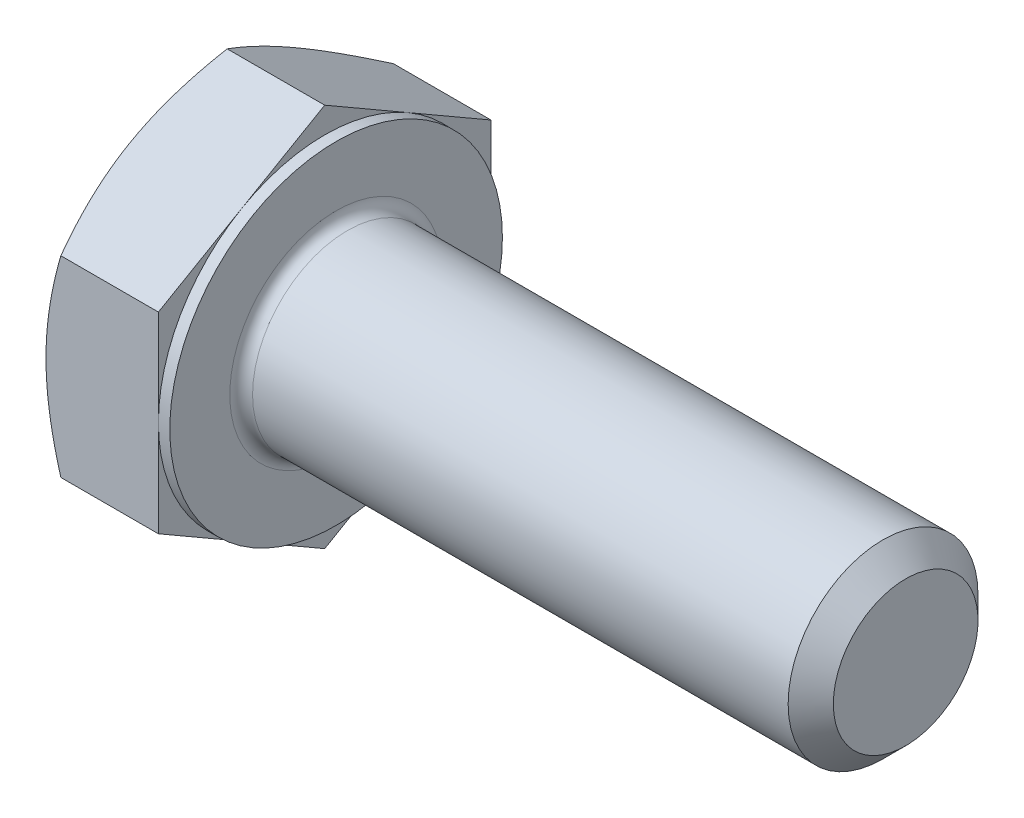
ISO-10303-21;
HEADER;
FILE_DESCRIPTION(('STEP AP214'),'2;1');
FILE_NAME('part.step','',(''),(''),'','','');
FILE_SCHEMA(('AUTOMOTIVE_DESIGN { 1 0 10303 214 1 1 1 1 }'));
ENDSEC;
DATA;
#1=APPLICATION_CONTEXT('core data for automotive mechanical design processes');
#2=APPLICATION_PROTOCOL_DEFINITION('international standard','automotive_design',2000,#1);
#3=PRODUCT_CONTEXT('',#1,'mechanical');
#4=PRODUCT('Part','Part','',(#3));
#5=PRODUCT_RELATED_PRODUCT_CATEGORY('part','',(#4));
#6=PRODUCT_DEFINITION_FORMATION('','',#4);
#7=PRODUCT_DEFINITION_CONTEXT('part definition',#1,'design');
#8=PRODUCT_DEFINITION('design','',#6,#7);
#9=PRODUCT_DEFINITION_SHAPE('','',#8);
#10=(LENGTH_UNIT() NAMED_UNIT(*) SI_UNIT(.MILLI.,.METRE.));
#11=(NAMED_UNIT(*) PLANE_ANGLE_UNIT() SI_UNIT($,.RADIAN.));
#12=(NAMED_UNIT(*) SI_UNIT($,.STERADIAN.) SOLID_ANGLE_UNIT());
#13=UNCERTAINTY_MEASURE_WITH_UNIT(LENGTH_MEASURE(1.E-05),#10,'distance_accuracy_value','');
#14=(GEOMETRIC_REPRESENTATION_CONTEXT(3) GLOBAL_UNCERTAINTY_ASSIGNED_CONTEXT((#13)) GLOBAL_UNIT_ASSIGNED_CONTEXT((#10,
#11,#12)) REPRESENTATION_CONTEXT('',''));
#15=CARTESIAN_POINT('',(0.,0.,0.));
#16=DIRECTION('',(0.,0.,1.));
#17=DIRECTION('',(1.,0.,0.));
#18=AXIS2_PLACEMENT_3D('',#15,#16,#17);
#19=CARTESIAN_POINT('',(4.1402,6.42313721478843,0.));
#20=DIRECTION('',(1.,0.,0.));
#21=DIRECTION('',(0.,0.,-1.));
#22=AXIS2_PLACEMENT_3D('',#19,#20,#21);
#23=PLANE('',#22);
#24=CARTESIAN_POINT('',(4.1402,0.,0.));
#25=DIRECTION('',(1.,0.,0.));
#26=DIRECTION('',(0.,0.,-1.));
#27=AXIS2_PLACEMENT_3D('',#24,#25,#26);
#28=CIRCLE('',#27,3.556);
#29=CARTESIAN_POINT('',(4.1402,0.,-3.556));
#30=VERTEX_POINT('',#29);
#31=EDGE_CURVE('E41',#30,#30,#28,.F.);
#32=ORIENTED_EDGE('',*,*,#31,.T.);
#33=EDGE_LOOP('',(#32));
#34=FACE_BOUND('',#33,.T.);
#35=CARTESIAN_POINT('',(4.1402,0.,0.));
#36=DIRECTION('',(1.,0.,0.));
#37=DIRECTION('',(0.,0.,-1.));
#38=AXIS2_PLACEMENT_3D('',#35,#36,#37);
#39=CIRCLE('',#38,5.5626);
#40=CARTESIAN_POINT('',(4.1402,0.,-5.5626));
#41=VERTEX_POINT('',#40);
#42=EDGE_CURVE('E298',#41,#41,#39,.T.);
#43=ORIENTED_EDGE('',*,*,#42,.T.);
#44=EDGE_LOOP('',(#43));
#45=FACE_BOUND('',#44,.T.);
#46=ADVANCED_FACE('F33',(#34,#45),#23,.T.);
#47=CARTESIAN_POINT('',(0.,0.,0.));
#48=DIRECTION('',(-1.,0.,0.));
#49=DIRECTION('',(0.,0.,1.));
#50=AXIS2_PLACEMENT_3D('',#47,#48,#49);
#51=CYLINDRICAL_SURFACE('',#50,3.175);
#52=CARTESIAN_POINT('',(4.5212,0.,0.));
#53=DIRECTION('',(1.,0.,0.));
#54=DIRECTION('',(0.,0.,-1.));
#55=AXIS2_PLACEMENT_3D('',#52,#53,#54);
#56=CIRCLE('',#55,3.175);
#57=CARTESIAN_POINT('',(4.5212,0.,-3.175));
#58=VERTEX_POINT('',#57);
#59=EDGE_CURVE('E11',#58,#58,#56,.T.);
#60=ORIENTED_EDGE('',*,*,#59,.T.);
#61=EDGE_LOOP('',(#60));
#62=FACE_BOUND('',#61,.T.);
#63=CARTESIAN_POINT('',(22.43455,0.,0.));
#64=DIRECTION('',(-1.,0.,0.));
#65=DIRECTION('',(0.,0.,1.));
#66=AXIS2_PLACEMENT_3D('',#63,#64,#65);
#67=CIRCLE('',#66,3.175);
#68=CARTESIAN_POINT('',(22.43455,0.,3.175));
#69=VERTEX_POINT('',#68);
#70=EDGE_CURVE('E277',#69,#69,#67,.T.);
#71=ORIENTED_EDGE('',*,*,#70,.T.);
#72=EDGE_LOOP('',(#71));
#73=FACE_BOUND('',#72,.T.);
#74=ADVANCED_FACE('F251',(#62,#73),#51,.T.);
#75=CARTESIAN_POINT('',(23.1902,0.,0.));
#76=DIRECTION('',(-1.,0.,0.));
#77=DIRECTION('',(0.,0.,1.));
#78=AXIS2_PLACEMENT_3D('',#75,#76,#77);
#79=CONICAL_SURFACE('',#78,2.41935,0.785398163397437);
#80=ORIENTED_EDGE('',*,*,#70,.F.);
#81=EDGE_LOOP('',(#80));
#82=FACE_BOUND('',#81,.T.);
#83=CARTESIAN_POINT('',(23.1902,0.,0.));
#84=DIRECTION('',(-1.,0.,0.));
#85=DIRECTION('',(0.,0.,1.));
#86=AXIS2_PLACEMENT_3D('',#83,#84,#85);
#87=CIRCLE('',#86,2.41935);
#88=CARTESIAN_POINT('',(23.1902,0.,2.41935));
#89=VERTEX_POINT('',#88);
#90=EDGE_CURVE('E275',#89,#89,#87,.T.);
#91=ORIENTED_EDGE('',*,*,#90,.T.);
#92=EDGE_LOOP('',(#91));
#93=FACE_BOUND('',#92,.T.);
#94=ADVANCED_FACE('F256',(#82,#93),#79,.T.);
#95=CARTESIAN_POINT('',(23.1902,0.,0.));
#96=DIRECTION('',(-1.,0.,0.));
#97=DIRECTION('',(0.,0.,1.));
#98=AXIS2_PLACEMENT_3D('',#95,#96,#97);
#99=PLANE('',#98);
#100=ORIENTED_EDGE('',*,*,#90,.F.);
#101=EDGE_LOOP('',(#100));
#102=FACE_BOUND('',#101,.T.);
#103=ADVANCED_FACE('F263',(#102),#99,.F.);
#104=CARTESIAN_POINT('',(3.7592,5.5626,0.));
#105=DIRECTION('',(1.,0.,0.));
#106=DIRECTION('',(0.,0.,-1.));
#107=AXIS2_PLACEMENT_3D('',#104,#105,#106);
#108=PLANE('',#107);
#109=DIRECTION('',(0.,0.5,0.866025403784438));
#110=VECTOR('',#109,1.);
#111=CARTESIAN_POINT('',(3.7592,3.21156860739421,-5.5626));
#112=LINE('',#111,#110);
#113=CARTESIAN_POINT('',(3.7592,3.21156860739421,-5.5626));
#114=VERTEX_POINT('',#113);
#115=CARTESIAN_POINT('',(3.7592,4.81735291109132,-2.7813));
#116=VERTEX_POINT('',#115);
#117=EDGE_CURVE('E165',#114,#116,#112,.T.);
#118=ORIENTED_EDGE('',*,*,#117,.T.);
#119=CARTESIAN_POINT('',(3.7592,0.,0.));
#120=DIRECTION('',(-1.,0.,0.));
#121=DIRECTION('',(0.,0.,1.));
#122=AXIS2_PLACEMENT_3D('',#119,#120,#121);
#123=CIRCLE('',#122,5.5626);
#124=CARTESIAN_POINT('',(3.7592,0.,-5.5626));
#125=VERTEX_POINT('',#124);
#126=EDGE_CURVE('E48',#116,#125,#123,.T.);
#127=ORIENTED_EDGE('',*,*,#126,.T.);
#128=DIRECTION('',(0.,1.,0.));
#129=VECTOR('',#128,1.);
#130=CARTESIAN_POINT('',(3.7592,3.21156860739421,-5.5626));
#131=LINE('',#130,#129);
#132=EDGE_CURVE('E301',#125,#114,#131,.T.);
#133=ORIENTED_EDGE('',*,*,#132,.T.);
#134=EDGE_LOOP('',(#118,#127,#133));
#135=FACE_BOUND('',#134,.T.);
#136=ADVANCED_FACE('F266',(#135),#108,.T.);
#137=CARTESIAN_POINT('',(3.7592,6.42313721478843,0.));
#138=VERTEX_POINT('',#137);
#139=EDGE_CURVE('E163',#116,#138,#112,.T.);
#140=ORIENTED_EDGE('',*,*,#139,.T.);
#141=DIRECTION('',(0.,-0.500000000000001,0.866025403784438));
#142=VECTOR('',#141,1.);
#143=CARTESIAN_POINT('',(3.7592,6.42313721478843,0.));
#144=LINE('',#143,#142);
#145=CARTESIAN_POINT('',(3.7592,4.81735291109131,2.78130000000001));
#146=VERTEX_POINT('',#145);
#147=EDGE_CURVE('E162',#138,#146,#144,.T.);
#148=ORIENTED_EDGE('',*,*,#147,.T.);
#149=EDGE_CURVE('E151',#146,#116,#123,.T.);
#150=ORIENTED_EDGE('',*,*,#149,.T.);
#151=EDGE_LOOP('',(#140,#148,#150));
#152=FACE_BOUND('',#151,.T.);
#153=ADVANCED_FACE('F271',(#152),#108,.T.);
#154=CARTESIAN_POINT('',(3.7592,3.21156860739421,5.5626));
#155=VERTEX_POINT('',#154);
#156=EDGE_CURVE('E130',#146,#155,#144,.T.);
#157=ORIENTED_EDGE('',*,*,#156,.T.);
#158=DIRECTION('',(0.,-1.,0.));
#159=VECTOR('',#158,1.);
#160=CARTESIAN_POINT('',(3.7592,3.21156860739421,5.5626));
#161=LINE('',#160,#159);
#162=CARTESIAN_POINT('',(3.7592,0.,5.5626));
#163=VERTEX_POINT('',#162);
#164=EDGE_CURVE('E124',#155,#163,#161,.T.);
#165=ORIENTED_EDGE('',*,*,#164,.T.);
#166=EDGE_CURVE('E128',#163,#146,#123,.T.);
#167=ORIENTED_EDGE('',*,*,#166,.T.);
#168=EDGE_LOOP('',(#157,#165,#167));
#169=FACE_BOUND('',#168,.T.);
#170=ADVANCED_FACE('F126',(#169),#108,.T.);
#171=CARTESIAN_POINT('',(3.7592,-3.21156860739422,5.5626));
#172=VERTEX_POINT('',#171);
#173=EDGE_CURVE('E134',#163,#172,#161,.T.);
#174=ORIENTED_EDGE('',*,*,#173,.T.);
#175=DIRECTION('',(0.,-0.5,-0.866025403784439));
#176=VECTOR('',#175,1.);
#177=CARTESIAN_POINT('',(3.7592,-6.42313721478844,0.));
#178=LINE('',#177,#176);
#179=CARTESIAN_POINT('',(3.7592,-4.81735291109132,2.7813));
#180=VERTEX_POINT('',#179);
#181=EDGE_CURVE('E141',#172,#180,#178,.T.);
#182=ORIENTED_EDGE('',*,*,#181,.T.);
#183=EDGE_CURVE('E138',#180,#163,#123,.T.);
#184=ORIENTED_EDGE('',*,*,#183,.T.);
#185=EDGE_LOOP('',(#174,#182,#184));
#186=FACE_BOUND('',#185,.T.);
#187=ADVANCED_FACE('F139',(#186),#108,.T.);
#188=CARTESIAN_POINT('',(3.7592,-6.42313721478844,0.));
#189=VERTEX_POINT('',#188);
#190=EDGE_CURVE('E157',#180,#189,#178,.T.);
#191=ORIENTED_EDGE('',*,*,#190,.T.);
#192=DIRECTION('',(0.,0.500000000000001,-0.866025403784438));
#193=VECTOR('',#192,1.);
#194=CARTESIAN_POINT('',(3.7592,-3.21156860739422,-5.5626));
#195=LINE('',#194,#193);
#196=CARTESIAN_POINT('',(3.7592,-4.81735291109132,-2.78130000000001));
#197=VERTEX_POINT('',#196);
#198=EDGE_CURVE('E339',#189,#197,#195,.T.);
#199=ORIENTED_EDGE('',*,*,#198,.T.);
#200=EDGE_CURVE('E145',#197,#180,#123,.T.);
#201=ORIENTED_EDGE('',*,*,#200,.T.);
#202=EDGE_LOOP('',(#191,#199,#201));
#203=FACE_BOUND('',#202,.T.);
#204=ADVANCED_FACE('F340',(#203),#108,.T.);
#205=CARTESIAN_POINT('',(3.7592,-3.21156860739422,-5.5626));
#206=VERTEX_POINT('',#205);
#207=EDGE_CURVE('E152',#197,#206,#195,.T.);
#208=ORIENTED_EDGE('',*,*,#207,.T.);
#209=EDGE_CURVE('E302',#206,#125,#131,.T.);
#210=ORIENTED_EDGE('',*,*,#209,.T.);
#211=EDGE_CURVE('E309',#125,#197,#123,.T.);
#212=ORIENTED_EDGE('',*,*,#211,.T.);
#213=EDGE_LOOP('',(#208,#210,#212));
#214=FACE_BOUND('',#213,.T.);
#215=ADVANCED_FACE('F272',(#214),#108,.T.);
#216=CARTESIAN_POINT('',(0.,0.,0.));
#217=DIRECTION('',(-1.,0.,0.));
#218=DIRECTION('',(0.,0.,1.));
#219=AXIS2_PLACEMENT_3D('',#216,#217,#218);
#220=CYLINDRICAL_SURFACE('',#219,5.5626);
#221=ORIENTED_EDGE('',*,*,#126,.F.);
#222=ORIENTED_EDGE('',*,*,#149,.F.);
#223=ORIENTED_EDGE('',*,*,#166,.F.);
#224=ORIENTED_EDGE('',*,*,#183,.F.);
#225=ORIENTED_EDGE('',*,*,#200,.F.);
#226=ORIENTED_EDGE('',*,*,#211,.F.);
#227=EDGE_LOOP('',(#221,#222,#223,#224,#225,#226));
#228=FACE_BOUND('',#227,.T.);
#229=ORIENTED_EDGE('',*,*,#42,.F.);
#230=EDGE_LOOP('',(#229));
#231=FACE_BOUND('',#230,.T.);
#232=ADVANCED_FACE('F148',(#228,#231),#220,.T.);
#233=CARTESIAN_POINT('',(0.,6.42313721478843,0.));
#234=DIRECTION('',(1.,0.,0.));
#235=DIRECTION('',(0.,0.,-1.));
#236=AXIS2_PLACEMENT_3D('',#233,#234,#235);
#237=PLANE('',#236);
#238=CARTESIAN_POINT('',(0.,0.,0.));
#239=DIRECTION('',(1.,0.,0.));
#240=DIRECTION('',(0.,0.,-1.));
#241=AXIS2_PLACEMENT_3D('',#238,#239,#240);
#242=CIRCLE('',#241,5.5626);
#243=CARTESIAN_POINT('',(0.,0.,-5.5626));
#244=VERTEX_POINT('',#243);
#245=CARTESIAN_POINT('',(0.,4.81735291109132,-2.7813));
#246=VERTEX_POINT('',#245);
#247=EDGE_CURVE('E297',#244,#246,#242,.T.);
#248=ORIENTED_EDGE('',*,*,#247,.F.);
#249=CARTESIAN_POINT('',(0.,-4.81735291109132,-2.78130000000001));
#250=VERTEX_POINT('',#249);
#251=EDGE_CURVE('E293',#250,#244,#242,.T.);
#252=ORIENTED_EDGE('',*,*,#251,.F.);
#253=CARTESIAN_POINT('',(0.,-4.81735291109132,2.7813));
#254=VERTEX_POINT('',#253);
#255=EDGE_CURVE('E296',#254,#250,#242,.T.);
#256=ORIENTED_EDGE('',*,*,#255,.F.);
#257=CARTESIAN_POINT('',(0.,0.,5.5626));
#258=VERTEX_POINT('',#257);
#259=EDGE_CURVE('E332',#258,#254,#242,.T.);
#260=ORIENTED_EDGE('',*,*,#259,.F.);
#261=CARTESIAN_POINT('',(0.,0.,0.));
#262=DIRECTION('',(-1.,0.,0.));
#263=DIRECTION('',(0.,0.,1.));
#264=AXIS2_PLACEMENT_3D('',#261,#262,#263);
#265=CIRCLE('',#264,5.5626);
#266=CARTESIAN_POINT('',(0.,4.81735291109131,2.78130000000001));
#267=VERTEX_POINT('',#266);
#268=EDGE_CURVE('E166',#258,#267,#265,.T.);
#269=ORIENTED_EDGE('',*,*,#268,.T.);
#270=EDGE_CURVE('E355',#246,#267,#242,.T.);
#271=ORIENTED_EDGE('',*,*,#270,.F.);
#272=EDGE_LOOP('',(#248,#252,#256,#260,#269,#271));
#273=FACE_BOUND('',#272,.T.);
#274=ADVANCED_FACE('F197',(#273),#237,.F.);
#275=CARTESIAN_POINT('',(0.,0.,0.));
#276=DIRECTION('',(1.,0.,0.));
#277=DIRECTION('',(0.,0.,-1.));
#278=AXIS2_PLACEMENT_3D('',#275,#276,#277);
#279=CONICAL_SURFACE('',#278,5.5626,1.0471975511966);
#280=CARTESIAN_POINT('',(0.496898061070134,3.21145313734037,5.5628));
#281=CARTESIAN_POINT('',(0.456146202255122,3.28204724097473,5.44052742579051));
#282=CARTESIAN_POINT('',(0.417243775308715,3.35290455380814,5.31779895987524));
#283=CARTESIAN_POINT('',(0.343647161560536,3.49519461931171,5.07134533701076));
#284=CARTESIAN_POINT('',(0.308954790139038,3.56662760615498,4.9476197744618));
#285=CARTESIAN_POINT('',(0.211873701066849,3.78207031570124,4.57446205540738));
#286=CARTESIAN_POINT('',(0.156654841923369,3.92693047016895,4.32355690787704));
#287=CARTESIAN_POINT('',(0.0919037861815252,4.14371105966188,3.94808191278055));
#288=CARTESIAN_POINT('',(0.0734579983429315,4.21498376345064,3.82463396862561));
#289=CARTESIAN_POINT('',(0.0425268916674603,4.35785122526849,3.57718026600868));
#290=CARTESIAN_POINT('',(0.0300410461890069,4.42944595427775,3.45317455781052));
#291=CARTESIAN_POINT('',(0.0113480299394699,4.57275976652506,3.20494775357179));
#292=CARTESIAN_POINT('',(0.00513373340584624,4.64447861567673,3.08072706298073));
#293=CARTESIAN_POINT('',(-0.000889599359095752,4.78797861662468,2.83217777045271));
#294=CARTESIAN_POINT('',(-0.000698833448295938,4.85975976642794,2.70784917196776));
#295=CARTESIAN_POINT('',(0.00862810136342396,5.05641945205558,2.36722460466016));
#296=CARTESIAN_POINT('',(0.0242873955350766,5.18123362079913,2.15104012289185));
#297=CARTESIAN_POINT('',(0.0739443233816058,5.4300329480179,1.72010704725999));
#298=CARTESIAN_POINT('',(0.107958931423458,5.55401723142852,1.50535996905278));
#299=CARTESIAN_POINT('',(0.192986041409678,5.80331731538365,1.0735595573113));
#300=CARTESIAN_POINT('',(0.244358813937402,5.92860165707087,0.856560712116214));
#301=CARTESIAN_POINT('',(0.360954456999594,6.17730193852899,0.425799188774085));
#302=CARTESIAN_POINT('',(0.426149937617059,6.30072106361907,0.212030993492364));
#303=CARTESIAN_POINT('',(0.496898061070138,6.42325268484227,-0.000199999999999969));
#304=B_SPLINE_CURVE_WITH_KNOTS('',3,(#280,#281,#282,#283,#284,#285,#286,#287,#288,#289,#290,
#291,#292,#293,#294,#295,#296,#297,#298,#299,#300,#301,#302,#303),.UNSPECIFIED.,.F.,.F.,(4,2,2,
2,2,2,2,2,2,2,2,4),(0.,0.44082011856227,0.881829648847399,1.76568130465016,2.19678242164486,
2.62784543796582,3.05841812523867,3.48897751176352,4.23854798324166,4.98881282275669,
5.75571809391027,6.52111769989992),.UNSPECIFIED.);
#305=CARTESIAN_POINT('',(0.496831392605784,6.42313721478843,0.));
#306=VERTEX_POINT('',#305);
#307=EDGE_CURVE('E217',#267,#306,#304,.T.);
#308=ORIENTED_EDGE('',*,*,#307,.T.);
#309=CARTESIAN_POINT('',(0.496898061070138,6.42325268484227,0.0002));
#310=CARTESIAN_POINT('',(0.456146202255126,6.35265858120791,-0.122072574209491));
#311=CARTESIAN_POINT('',(0.417243775308719,6.2818012683745,-0.244801040124762));
#312=CARTESIAN_POINT('',(0.34364716156054,6.13951120287093,-0.491254662989243));
#313=CARTESIAN_POINT('',(0.308954790139042,6.06807821602766,-0.614980225538197));
#314=CARTESIAN_POINT('',(0.211873701066854,5.8526355064814,-0.98813794459262));
#315=CARTESIAN_POINT('',(0.156654841923372,5.70777535201369,-1.23904309212296));
#316=CARTESIAN_POINT('',(0.0919037861815281,5.49099476252076,-1.61451808721945));
#317=CARTESIAN_POINT('',(0.0734579983429345,5.419722058732,-1.7379660313744));
#318=CARTESIAN_POINT('',(0.042526891667463,5.27685459691414,-1.98541973399132));
#319=CARTESIAN_POINT('',(0.0300410461890094,5.20525986790489,-2.10942544218948));
#320=CARTESIAN_POINT('',(0.0113480299394723,5.06194605565758,-2.35765224642821));
#321=CARTESIAN_POINT('',(0.00513373340584881,4.9902272065059,-2.48187293701927));
#322=CARTESIAN_POINT('',(-0.000889599359093555,4.84672720555796,-2.7304222295473));
#323=CARTESIAN_POINT('',(-0.000698833448294276,4.7749460557547,-2.85475082803225));
#324=CARTESIAN_POINT('',(0.00862810136342481,4.57828637012706,-3.19537539533984));
#325=CARTESIAN_POINT('',(0.0242873955350776,4.45347220138351,-3.41155987710816));
#326=CARTESIAN_POINT('',(0.0739443233816067,4.20467287416474,-3.84249295274001));
#327=CARTESIAN_POINT('',(0.107958931423459,4.08068859075412,-4.05724003094723));
#328=CARTESIAN_POINT('',(0.192986041409677,3.83138850679899,-4.4890404426887));
#329=CARTESIAN_POINT('',(0.244358813937401,3.70610416511177,-4.70603928788379));
#330=CARTESIAN_POINT('',(0.360954456999593,3.45740388365366,-5.13680081122592));
#331=CARTESIAN_POINT('',(0.426149937617057,3.33398475856357,-5.35056900650764));
#332=CARTESIAN_POINT('',(0.496898061070136,3.21145313734038,-5.5628));
#333=B_SPLINE_CURVE_WITH_KNOTS('',3,(#309,#310,#311,#312,#313,#314,#315,#316,#317,#318,#319,
#320,#321,#322,#323,#324,#325,#326,#327,#328,#329,#330,#331,#332),.UNSPECIFIED.,.F.,.F.,(4,2,2,
2,2,2,2,2,2,2,2,4),(0.,0.440820118562269,0.881829648847399,1.76568130465016,2.19678242164486,
2.62784543796583,3.05841812523868,3.48897751176352,4.23854798324166,4.98881282275669,
5.75571809391027,6.52111769989992),.UNSPECIFIED.);
#334=EDGE_CURVE('E56',#306,#246,#333,.T.);
#335=ORIENTED_EDGE('',*,*,#334,.T.);
#336=ORIENTED_EDGE('',*,*,#270,.T.);
#337=EDGE_LOOP('',(#308,#335,#336));
#338=FACE_BOUND('',#337,.T.);
#339=ADVANCED_FACE('F356',(#338),#279,.T.);
#340=CARTESIAN_POINT('',(2.7686789213525,-8.73770923956874,5.5626));
#341=CARTESIAN_POINT('',(2.64990389200677,-8.49376920201855,5.5626));
#342=CARTESIAN_POINT('',(2.53223615988295,-8.2492809046105,5.5626));
#343=CARTESIAN_POINT('',(2.29973601116896,-7.75891658689067,5.5626));
#344=CARTESIAN_POINT('',(2.18490402082366,-7.51304036469992,5.5626));
#345=CARTESIAN_POINT('',(1.95814206982153,-7.01839500466022,5.5626));
#346=CARTESIAN_POINT('',(1.8462303711962,-6.769617466765,5.5626));
#347=CARTESIAN_POINT('',(1.62684171043843,-6.27012180502533,5.5626));
#348=CARTESIAN_POINT('',(1.51936454582433,-6.01940377040651,5.5626));
#349=CARTESIAN_POINT('',(1.30650332958568,-5.50718489258319,5.5626));
#350=CARTESIAN_POINT('',(1.20131017396898,-5.24560429752157,5.5626));
#351=CARTESIAN_POINT('',(0.998619812145383,-4.71942399237131,5.5626));
#352=CARTESIAN_POINT('',(0.901123453633257,-4.45482395339598,5.5626));
#353=CARTESIAN_POINT('',(0.716304368198965,-3.92264484288169,5.5626));
#354=CARTESIAN_POINT('',(0.628961986905316,-3.65507266309922,5.5626));
#355=CARTESIAN_POINT('',(0.467180530813785,-3.11608883817834,5.5626));
#356=CARTESIAN_POINT('',(0.392737508963364,-2.84467839509523,5.5626));
#357=CARTESIAN_POINT('',(0.260643632218191,-2.29937288511399,5.5626));
#358=CARTESIAN_POINT('',(0.202899681395567,-2.02550072849383,5.5626));
#359=CARTESIAN_POINT('',(0.107411233188163,-1.47419871210055,5.5626));
#360=CARTESIAN_POINT('',(0.0696645931562898,-1.19676923674639,5.5626));
#361=CARTESIAN_POINT('',(0.0305431445101982,-0.780906044666211,5.5626));
#362=CARTESIAN_POINT('',(0.0204298489065882,-0.643261411518605,5.5626));
#363=CARTESIAN_POINT('',(0.00603400266760489,-0.367672172448939,5.5626));
#364=CARTESIAN_POINT('',(0.00175090065047216,-0.229727596129606,5.5626));
#365=CARTESIAN_POINT('',(-0.000877258434576259,0.0462298203811281,5.5626));
#366=CARTESIAN_POINT('',(0.000778204000041328,0.184242665488668,5.5626));
#367=CARTESIAN_POINT('',(0.00998447093121828,0.460061868257555,5.5626));
#368=CARTESIAN_POINT('',(0.0175350494406537,0.597868233631338,5.5626));
#369=CARTESIAN_POINT('',(0.0423475230043664,0.925701510882075,5.5626));
#370=CARTESIAN_POINT('',(0.0622197104227484,1.1155352953173,5.5626));
#371=CARTESIAN_POINT('',(0.112092229852565,1.49385755224913,5.5626));
#372=CARTESIAN_POINT('',(0.14209384301138,1.68234585149089,5.5626));
#373=CARTESIAN_POINT('',(0.24570718800647,2.24553584313323,5.5626));
#374=CARTESIAN_POINT('',(0.332911162519985,2.61777353964678,5.5626));
#375=CARTESIAN_POINT('',(0.48497131723836,3.17463937817239,5.5626));
#376=CARTESIAN_POINT('',(0.539950529861259,3.36213116539036,5.5626));
#377=CARTESIAN_POINT('',(0.655825959293579,3.73529534319524,5.5626));
#378=CARTESIAN_POINT('',(0.716722221056285,3.92096771994784,5.5626));
#379=CARTESIAN_POINT('',(0.843437522365723,4.29054955301808,5.5626));
#380=CARTESIAN_POINT('',(0.909255140379616,4.47445950122946,5.5626));
#381=CARTESIAN_POINT('',(1.04501805536364,4.84073993427521,5.5626));
#382=CARTESIAN_POINT('',(1.11496326199657,5.02311045270205,5.5626));
#383=CARTESIAN_POINT('',(1.30670332614959,5.50920768233716,5.5626));
#384=CARTESIAN_POINT('',(1.43161029450912,5.81170559779751,5.5626));
#385=CARTESIAN_POINT('',(1.68864300447835,6.41363008030717,5.5626));
#386=CARTESIAN_POINT('',(1.82076951229499,6.71305631733947,5.5626));
#387=CARTESIAN_POINT('',(2.09055145564157,7.30953269981514,5.5626));
#388=CARTESIAN_POINT('',(2.22820891693107,7.60658192600063,5.5626));
#389=CARTESIAN_POINT('',(2.50774521012558,8.1986666860781,5.5626));
#390=CARTESIAN_POINT('',(2.64962387803047,8.49370229765588,5.5626));
#391=CARTESIAN_POINT('',(2.93691564950742,9.08261504642202,5.5626));
#392=CARTESIAN_POINT('',(3.08233392828017,9.37648965384624,5.5626));
#393=CARTESIAN_POINT('',(3.37581584568178,9.96291541504303,5.5626));
#394=CARTESIAN_POINT('',(3.52387950528227,10.2554665583006,5.5626));
#395=CARTESIAN_POINT('',(3.97117391045415,11.1313757573771,5.5626));
#396=CARTESIAN_POINT('',(4.27357054767448,11.7131163997573,5.5626));
#397=CARTESIAN_POINT('',(4.85224603298934,12.8132069930515,5.5626));
#398=CARTESIAN_POINT('',(5.12796685515923,13.3318519013386,5.5626));
#399=CARTESIAN_POINT('',(5.68275678705352,14.3673864470424,5.5626));
#400=CARTESIAN_POINT('',(5.96182609452877,14.8842759784563,5.5626));
#401=CARTESIAN_POINT('',(6.52152736357445,15.9150112451497,5.5626));
#402=CARTESIAN_POINT('',(6.80215119377595,16.4288614028154,5.5626));
#403=CARTESIAN_POINT('',(7.36530536401569,17.4554650741087,5.5626));
#404=CARTESIAN_POINT('',(7.64783555610709,17.9682186688609,5.5626));
#405=CARTESIAN_POINT('',(7.9310607289938,18.480585673198,5.5626));
#406=B_SPLINE_CURVE_WITH_KNOTS('',3,(#340,#341,#342,#343,#344,#345,#346,#347,#348,#349,#350,
#351,#352,#353,#354,#355,#356,#357,#358,#359,#360,#361,#362,#363,#364,#365,#366,#367,#368,#369,
#370,#371,#372,#373,#374,#375,#376,#377,#378,#379,#380,#381,#382,#383,#384,#385,#386,#387,#388,
#389,#390,#391,#392,#393,#394,#395,#396,#397,#398,#399,#400,#401,#402,#403,#404,#405),
.UNSPECIFIED.,.F.,.F.,(4,2,2,2,2,2,2,2,2,2,2,2,2,2,2,2,2,2,2,2,2,2,2,2,2,2,2,2,2,2,2,2,4),(0.,
0.813967810448124,1.62805723402188,2.44639311684123,3.26469159284327,4.11041719398351,
4.95623581042217,5.80038896849358,6.64428336772286,7.48337819505887,8.32238309790871,
8.73632540535188,9.1502285621055,9.56416792777519,9.97809142600941,10.5503838620518,
11.1227487075084,12.2680451878283,12.8541526378482,13.4402645410196,14.0262077950639,
14.612138229793,15.5938140100655,16.5755941783361,17.5577372698438,18.5398422533388,
19.5234814671836,20.5071284824279,22.4739984597053,24.236124059708,25.998354242499,
27.7548024802359,29.5111159383424),.UNSPECIFIED.);
#407=CARTESIAN_POINT('',(0.496831392605779,3.21156860739421,5.5626));
#408=VERTEX_POINT('',#407);
#409=EDGE_CURVE('E231',#258,#408,#406,.T.);
#410=ORIENTED_EDGE('',*,*,#409,.T.);
#411=EDGE_CURVE('E230',#408,#267,#304,.T.);
#412=ORIENTED_EDGE('',*,*,#411,.T.);
#413=ORIENTED_EDGE('',*,*,#268,.F.);
#414=EDGE_LOOP('',(#410,#412,#413));
#415=FACE_BOUND('',#414,.T.);
#416=ADVANCED_FACE('F326',(#415),#279,.T.);
#417=CARTESIAN_POINT('',(0.496831392605784,-3.21156860739422,5.5626));
#418=VERTEX_POINT('',#417);
#419=EDGE_CURVE('E278',#418,#258,#406,.T.);
#420=ORIENTED_EDGE('',*,*,#419,.T.);
#421=ORIENTED_EDGE('',*,*,#259,.T.);
#422=CARTESIAN_POINT('',(0.496898061070144,-6.42325268484228,-0.000200000000000273));
#423=CARTESIAN_POINT('',(0.456146202255131,-6.35265858120792,0.122072574209491));
#424=CARTESIAN_POINT('',(0.417243775308724,-6.28180126837451,0.244801040124762));
#425=CARTESIAN_POINT('',(0.343647161560545,-6.13951120287094,0.491254662989244));
#426=CARTESIAN_POINT('',(0.308954790139047,-6.06807821602766,0.614980225538198));
#427=CARTESIAN_POINT('',(0.211873701066858,-5.85263550648141,0.988137944592621));
#428=CARTESIAN_POINT('',(0.156654841923377,-5.7077753520137,1.23904309212296));
#429=CARTESIAN_POINT('',(0.0919037861815329,-5.49099476252077,1.61451808721946));
#430=CARTESIAN_POINT('',(0.073457998342939,-5.419722058732,1.7379660313744));
#431=CARTESIAN_POINT('',(0.0425268916674674,-5.27685459691415,1.98541973399132));
#432=CARTESIAN_POINT('',(0.0300410461890137,-5.2052598679049,2.10942544218948));
#433=CARTESIAN_POINT('',(0.0113480299394767,-5.06194605565758,2.35765224642821));
#434=CARTESIAN_POINT('',(0.00513373340585332,-4.99022720650591,2.48187293701928));
#435=CARTESIAN_POINT('',(-0.000889599359088796,-4.84672720555796,2.7304222295473));
#436=CARTESIAN_POINT('',(-0.000698833448289331,-4.77494605575471,2.85475082803225));
#437=CARTESIAN_POINT('',(0.00862810136342991,-4.57828637012707,3.19537539533985));
#438=CARTESIAN_POINT('',(0.0242873955350824,-4.45347220138351,3.41155987710816));
#439=CARTESIAN_POINT('',(0.073944323381611,-4.20467287416475,3.84249295274002));
#440=CARTESIAN_POINT('',(0.107958931423463,-4.08068859075413,4.05724003094723));
#441=CARTESIAN_POINT('',(0.192986041409681,-3.831388506799,4.4890404426887));
#442=CARTESIAN_POINT('',(0.244358813937405,-3.70610416511178,4.70603928788379));
#443=CARTESIAN_POINT('',(0.360954456999596,-3.45740388365367,5.13680081122592));
#444=CARTESIAN_POINT('',(0.42614993761706,-3.33398475856359,5.35056900650764));
#445=CARTESIAN_POINT('',(0.496898061070138,-3.21145313734039,5.5628));
#446=B_SPLINE_CURVE_WITH_KNOTS('',3,(#422,#423,#424,#425,#426,#427,#428,#429,#430,#431,#432,
#433,#434,#435,#436,#437,#438,#439,#440,#441,#442,#443,#444,#445),.UNSPECIFIED.,.F.,.F.,(4,2,2,
2,2,2,2,2,2,2,2,4),(0.,0.44082011856227,0.8818296488474,1.76568130465016,2.19678242164486,
2.62784543796583,3.05841812523868,3.48897751176353,4.23854798324166,4.98881282275669,
5.75571809391027,6.52111769989992),.UNSPECIFIED.);
#447=EDGE_CURVE('E219',#254,#418,#446,.T.);
#448=ORIENTED_EDGE('',*,*,#447,.T.);
#449=EDGE_LOOP('',(#420,#421,#448));
#450=FACE_BOUND('',#449,.T.);
#451=ADVANCED_FACE('F186',(#450),#279,.T.);
#452=CARTESIAN_POINT('',(0.496831392605788,-6.42313721478844,0.));
#453=VERTEX_POINT('',#452);
#454=EDGE_CURVE('E211',#453,#254,#446,.T.);
#455=ORIENTED_EDGE('',*,*,#454,.T.);
#456=ORIENTED_EDGE('',*,*,#255,.T.);
#457=CARTESIAN_POINT('',(0.496898061070138,-3.21145313734038,-5.5628));
#458=CARTESIAN_POINT('',(0.456146202255126,-3.28204724097474,-5.44052742579051));
#459=CARTESIAN_POINT('',(0.417243775308719,-3.35290455380815,-5.31779895987524));
#460=CARTESIAN_POINT('',(0.34364716156054,-3.49519461931172,-5.07134533701076));
#461=CARTESIAN_POINT('',(0.308954790139042,-3.56662760615499,-4.94761977446181));
#462=CARTESIAN_POINT('',(0.211873701066854,-3.78207031570125,-4.57446205540738));
#463=CARTESIAN_POINT('',(0.156654841923373,-3.92693047016896,-4.32355690787704));
#464=CARTESIAN_POINT('',(0.09190378618153,-4.14371105966189,-3.94808191278055));
#465=CARTESIAN_POINT('',(0.0734579983429365,-4.21498376345065,-3.82463396862561));
#466=CARTESIAN_POINT('',(0.0425268916674651,-4.3578512252685,-3.57718026600868));
#467=CARTESIAN_POINT('',(0.0300410461890113,-4.42944595427776,-3.45317455781052));
#468=CARTESIAN_POINT('',(0.0113480299394745,-4.57275976652507,-3.20494775357179));
#469=CARTESIAN_POINT('',(0.0051337334058514,-4.64447861567675,-3.08072706298073));
#470=CARTESIAN_POINT('',(-0.000889599359090393,-4.78797861662469,-2.8321777704527));
#471=CARTESIAN_POINT('',(-0.000698833448290957,-4.85975976642795,-2.70784917196775));
#472=CARTESIAN_POINT('',(0.00862810136342864,-5.05641945205559,-2.36722460466016));
#473=CARTESIAN_POINT('',(0.0242873955350819,-5.18123362079915,-2.15104012289184));
#474=CARTESIAN_POINT('',(0.0739443233816118,-5.43003294801791,-1.72010704725999));
#475=CARTESIAN_POINT('',(0.107958931423464,-5.55401723142853,-1.50535996905278));
#476=CARTESIAN_POINT('',(0.192986041409683,-5.80331731538366,-1.0735595573113));
#477=CARTESIAN_POINT('',(0.244358813937407,-5.92860165707088,-0.856560712116213));
#478=CARTESIAN_POINT('',(0.360954456999599,-6.177301938529,-0.425799188774084));
#479=CARTESIAN_POINT('',(0.426149937617064,-6.30072106361908,-0.212030993492364));
#480=CARTESIAN_POINT('',(0.496898061070143,-6.42325268484228,0.000200000000000022));
#481=B_SPLINE_CURVE_WITH_KNOTS('',3,(#457,#458,#459,#460,#461,#462,#463,#464,#465,#466,#467,
#468,#469,#470,#471,#472,#473,#474,#475,#476,#477,#478,#479,#480),.UNSPECIFIED.,.F.,.F.,(4,2,2,
2,2,2,2,2,2,2,2,4),(0.,0.440820118562269,0.881829648847398,1.76568130465016,2.19678242164486,
2.62784543796583,3.05841812523867,3.48897751176352,4.23854798324166,4.98881282275669,
5.75571809391027,6.52111769989992),.UNSPECIFIED.);
#482=EDGE_CURVE('E218',#250,#453,#481,.T.);
#483=ORIENTED_EDGE('',*,*,#482,.T.);
#484=EDGE_LOOP('',(#455,#456,#483));
#485=FACE_BOUND('',#484,.T.);
#486=ADVANCED_FACE('F354',(#485),#279,.T.);
#487=CARTESIAN_POINT('',(0.496831392605781,3.21156860739421,-5.5626));
#488=VERTEX_POINT('',#487);
#489=EDGE_CURVE('E220',#246,#488,#333,.T.);
#490=ORIENTED_EDGE('',*,*,#489,.T.);
#491=CARTESIAN_POINT('',(2.76867892311477,-8.73770924318712,-5.5626));
#492=CARTESIAN_POINT('',(2.64990389369555,-8.49376920551512,-5.5626));
#493=CARTESIAN_POINT('',(2.53223616149828,-8.24928090798519,-5.5626));
#494=CARTESIAN_POINT('',(2.29973601263776,-7.7589165900212,-5.5626));
#495=CARTESIAN_POINT('',(2.18490402221938,-7.51304036770819,-5.5626));
#496=CARTESIAN_POINT('',(1.95814207107102,-7.01839500742212,-5.5626));
#497=CARTESIAN_POINT('',(1.84623037237257,-6.76961746940278,-5.5626));
#498=CARTESIAN_POINT('',(1.62684171146978,-6.27012180741404,-5.5626));
#499=CARTESIAN_POINT('',(1.51936454678377,-6.01940377267026,-5.5626));
#500=CARTESIAN_POINT('',(1.30650333039917,-5.50718489458725,-5.5626));
#501=CARTESIAN_POINT('',(1.2013101747086,-5.24560429939082,-5.5626));
#502=CARTESIAN_POINT('',(0.998619812741177,-4.71942399396877,-5.5626));
#503=CARTESIAN_POINT('',(0.901123454159102,-4.45482395485647,-5.5626));
#504=CARTESIAN_POINT('',(0.716304368591561,-3.9226448440657,-5.5626));
#505=CARTESIAN_POINT('',(0.628961987234592,-3.65507266414374,-5.5626));
#506=CARTESIAN_POINT('',(0.467180531026692,-3.11608883894008,-5.5626));
#507=CARTESIAN_POINT('',(0.392737509123215,-2.84467839571368,-5.5626));
#508=CARTESIAN_POINT('',(0.2606436322709,-2.29937288537276,-5.5626));
#509=CARTESIAN_POINT('',(0.202899681398244,-2.02550072853519,-5.5626));
#510=CARTESIAN_POINT('',(0.107411233123557,-1.47419871170172,-5.5626));
#511=CARTESIAN_POINT('',(0.0696645930744095,-1.19676923612478,-5.5626));
#512=CARTESIAN_POINT('',(0.0305431444320201,-0.780906043711957,-5.5626));
#513=CARTESIAN_POINT('',(0.0204298488344497,-0.643261410455078,-5.5626));
#514=CARTESIAN_POINT('',(0.00603400261720246,-0.367672171167071,-5.5626));
#515=CARTESIAN_POINT('',(0.00175090061576448,-0.229727594738672,-5.5626));
#516=CARTESIAN_POINT('',(-0.000877258428423861,0.0462298219894166,-5.5626));
#517=CARTESIAN_POINT('',(0.000778204031362287,0.184242667205245,-5.5626));
#518=CARTESIAN_POINT('',(0.00998447102168119,0.460061870189281,-5.5626));
#519=CARTESIAN_POINT('',(0.0175350495650893,0.597868235669925,-5.5626));
#520=CARTESIAN_POINT('',(0.0423475232123259,0.925701513084967,-5.5626));
#521=CARTESIAN_POINT('',(0.0622197106787279,1.11553529757717,-5.5626));
#522=CARTESIAN_POINT('',(0.112092230207143,1.49385755462035,-5.5626));
#523=CARTESIAN_POINT('',(0.142093843416536,1.6823458539165,-5.5626));
#524=CARTESIAN_POINT('',(0.245707188564406,2.24553584571898,-5.5626));
#525=CARTESIAN_POINT('',(0.332911163181101,2.61777354233506,-5.5626));
#526=CARTESIAN_POINT('',(0.484971318051693,3.17463938101403,-5.5626));
#527=CARTESIAN_POINT('',(0.539950530725681,3.36213116828422,-5.5626));
#528=CARTESIAN_POINT('',(0.655825960258599,3.73529534619296,-5.5626));
#529=CARTESIAN_POINT('',(0.716722222070815,3.92096772299719,-5.5626));
#530=CARTESIAN_POINT('',(0.84343752347748,4.2905495561703,-5.5626));
#531=CARTESIAN_POINT('',(0.909255141539088,4.47445950443293,-5.5626));
#532=CARTESIAN_POINT('',(1.04501805661687,4.84073993758116,-5.5626));
#533=CARTESIAN_POINT('',(1.11496326329584,5.02311045605925,-5.5626));
#534=CARTESIAN_POINT('',(1.30670332752746,5.50920768572384,-5.5626));
#535=CARTESIAN_POINT('',(1.43161029591472,5.81170560116389,-5.5626));
#536=CARTESIAN_POINT('',(1.68864300593148,6.41363008363555,-5.5626));
#537=CARTESIAN_POINT('',(1.8207695137679,6.71305632065014,-5.5626));
#538=CARTESIAN_POINT('',(2.09055145714828,7.30953270309229,-5.5626));
#539=CARTESIAN_POINT('',(2.22820891845178,7.60658192926197,-5.5626));
#540=CARTESIAN_POINT('',(2.50774521167021,8.19866668930951,-5.5626));
#541=CARTESIAN_POINT('',(2.64962387958501,8.49370230087319,-5.5626));
#542=CARTESIAN_POINT('',(2.93691565107837,9.08261504961154,-5.5626));
#543=CARTESIAN_POINT('',(3.0823339298576,9.37648965702208,-5.5626));
#544=CARTESIAN_POINT('',(3.3758158472699,9.96291541819257,-5.5626));
#545=CARTESIAN_POINT('',(3.52387950687461,10.2554665614375,-5.5626));
#546=CARTESIAN_POINT('',(3.97117391205672,11.1313757604775,-5.5626));
#547=CARTESIAN_POINT('',(4.27357054928055,11.7131164028352,-5.5626));
#548=CARTESIAN_POINT('',(4.85224603460798,12.8132069961068,-5.5626));
#549=CARTESIAN_POINT('',(5.12796685678751,13.3318519043937,-5.5626));
#550=CARTESIAN_POINT('',(5.68275678869909,14.3673864500981,-5.5626));
#551=CARTESIAN_POINT('',(5.961826096182,14.8842759815126,-5.5626));
#552=CARTESIAN_POINT('',(6.52152736524337,15.9150112482114,-5.5626));
#553=CARTESIAN_POINT('',(6.80215119545292,16.4288614058816,-5.5626));
#554=CARTESIAN_POINT('',(7.36530536570786,17.4554650771845,-5.5626));
#555=CARTESIAN_POINT('',(7.64783555780641,17.9682186719418,-5.5626));
#556=CARTESIAN_POINT('',(7.93106073069999,18.4805856762842,-5.5626));
#557=B_SPLINE_CURVE_WITH_KNOTS('',3,(#491,#492,#493,#494,#495,#496,#497,#498,#499,#500,#501,
#502,#503,#504,#505,#506,#507,#508,#509,#510,#511,#512,#513,#514,#515,#516,#517,#518,#519,#520,
#521,#522,#523,#524,#525,#526,#527,#528,#529,#530,#531,#532,#533,#534,#535,#536,#537,#538,#539,
#540,#541,#542,#543,#544,#545,#546,#547,#548,#549,#550,#551,#552,#553,#554,#555,#556),
.UNSPECIFIED.,.F.,.F.,(4,2,2,2,2,2,2,2,2,2,2,2,2,2,2,2,2,2,2,2,2,2,2,2,2,2,2,2,2,2,2,2,4),(0.,
0.813967810873175,1.62805723487204,2.44639311812096,3.26469159455254,4.11041719615067,
4.95623581304736,5.80038897157531,6.64428337126078,7.48337819926455,8.3223831027812,
8.7363254105497,9.15022856762858,9.56416793362373,9.97809143218336,10.5503838684107,
11.1227487140522,12.2680451947427,12.8541526449562,13.4402645483211,14.0262078025585,
14.6121382374805,15.5938140177288,16.5755941859749,17.5577372774573,18.5398422609271,
19.5234814747438,20.50712848996,22.4739984671821,24.2361240671979,25.9983542500018,
27.7548024877621,29.5111159458924),.UNSPECIFIED.);
#558=EDGE_CURVE('E178',#488,#244,#557,.F.);
#559=ORIENTED_EDGE('',*,*,#558,.T.);
#560=ORIENTED_EDGE('',*,*,#247,.T.);
#561=EDGE_LOOP('',(#490,#559,#560));
#562=FACE_BOUND('',#561,.T.);
#563=ADVANCED_FACE('F351',(#562),#279,.T.);
#564=CARTESIAN_POINT('',(0.496831392605571,-3.21156860739454,-5.5626));
#565=VERTEX_POINT('',#564);
#566=EDGE_CURVE('E179',#565,#250,#481,.T.);
#567=ORIENTED_EDGE('',*,*,#566,.T.);
#568=ORIENTED_EDGE('',*,*,#251,.T.);
#569=EDGE_CURVE('E169',#244,#565,#557,.F.);
#570=ORIENTED_EDGE('',*,*,#569,.T.);
#571=EDGE_LOOP('',(#567,#568,#570));
#572=FACE_BOUND('',#571,.T.);
#573=ADVANCED_FACE('F195',(#572),#279,.T.);
#574=CARTESIAN_POINT('',(4.1402,3.21156860739421,-5.5626));
#575=DIRECTION('',(0.,0.,1.));
#576=DIRECTION('',(0.,-1.,0.));
#577=AXIS2_PLACEMENT_3D('',#574,#575,#576);
#578=PLANE('',#577);
#579=ORIENTED_EDGE('',*,*,#209,.F.);
#580=DIRECTION('',(-1.,0.,0.));
#581=VECTOR('',#580,1.);
#582=CARTESIAN_POINT('',(4.1402,-3.21156860739422,-5.5626));
#583=LINE('',#582,#581);
#584=EDGE_CURVE('E284',#206,#565,#583,.T.);
#585=ORIENTED_EDGE('',*,*,#584,.T.);
#586=ORIENTED_EDGE('',*,*,#569,.F.);
#587=ORIENTED_EDGE('',*,*,#558,.F.);
#588=DIRECTION('',(-1.,0.,0.));
#589=VECTOR('',#588,1.);
#590=CARTESIAN_POINT('',(4.1402,3.21156860739421,-5.5626));
#591=LINE('',#590,#589);
#592=EDGE_CURVE('E280',#114,#488,#591,.T.);
#593=ORIENTED_EDGE('',*,*,#592,.F.);
#594=ORIENTED_EDGE('',*,*,#132,.F.);
#595=EDGE_LOOP('',(#579,#585,#586,#587,#593,#594));
#596=FACE_BOUND('',#595,.T.);
#597=ADVANCED_FACE('F190',(#596),#578,.F.);
#598=CARTESIAN_POINT('',(4.1402,-3.21156860739422,-5.5626));
#599=DIRECTION('',(0.,0.866025403784438,0.500000000000001));
#600=DIRECTION('',(0.,-0.500000000000001,0.866025403784438));
#601=AXIS2_PLACEMENT_3D('',#598,#599,#600);
#602=PLANE('',#601);
#603=ORIENTED_EDGE('',*,*,#198,.F.);
#604=DIRECTION('',(-1.,0.,0.));
#605=VECTOR('',#604,1.);
#606=CARTESIAN_POINT('',(4.1402,-6.42313721478844,0.));
#607=LINE('',#606,#605);
#608=EDGE_CURVE('E286',#189,#453,#607,.T.);
#609=ORIENTED_EDGE('',*,*,#608,.T.);
#610=ORIENTED_EDGE('',*,*,#482,.F.);
#611=ORIENTED_EDGE('',*,*,#566,.F.);
#612=ORIENTED_EDGE('',*,*,#584,.F.);
#613=ORIENTED_EDGE('',*,*,#207,.F.);
#614=EDGE_LOOP('',(#603,#609,#610,#611,#612,#613));
#615=FACE_BOUND('',#614,.T.);
#616=ADVANCED_FACE('F194',(#615),#602,.F.);
#617=CARTESIAN_POINT('',(4.1402,-6.42313721478844,0.));
#618=DIRECTION('',(0.,0.866025403784438,-0.5));
#619=DIRECTION('',(0.,0.5,0.866025403784439));
#620=AXIS2_PLACEMENT_3D('',#617,#618,#619);
#621=PLANE('',#620);
#622=ORIENTED_EDGE('',*,*,#181,.F.);
#623=DIRECTION('',(-1.,0.,0.));
#624=VECTOR('',#623,1.);
#625=CARTESIAN_POINT('',(4.1402,-3.21156860739422,5.5626));
#626=LINE('',#625,#624);
#627=EDGE_CURVE('E156',#172,#418,#626,.T.);
#628=ORIENTED_EDGE('',*,*,#627,.T.);
#629=ORIENTED_EDGE('',*,*,#447,.F.);
#630=ORIENTED_EDGE('',*,*,#454,.F.);
#631=ORIENTED_EDGE('',*,*,#608,.F.);
#632=ORIENTED_EDGE('',*,*,#190,.F.);
#633=EDGE_LOOP('',(#622,#628,#629,#630,#631,#632));
#634=FACE_BOUND('',#633,.T.);
#635=ADVANCED_FACE('F202',(#634),#621,.F.);
#636=CARTESIAN_POINT('',(4.1402,3.21156860739421,5.5626));
#637=DIRECTION('',(0.,0.,-1.));
#638=DIRECTION('',(-1.,0.,0.));
#639=AXIS2_PLACEMENT_3D('',#636,#637,#638);
#640=PLANE('',#639);
#641=ORIENTED_EDGE('',*,*,#164,.F.);
#642=DIRECTION('',(-1.,0.,0.));
#643=VECTOR('',#642,1.);
#644=CARTESIAN_POINT('',(4.1402,3.21156860739421,5.5626));
#645=LINE('',#644,#643);
#646=EDGE_CURVE('E289',#155,#408,#645,.T.);
#647=ORIENTED_EDGE('',*,*,#646,.T.);
#648=ORIENTED_EDGE('',*,*,#409,.F.);
#649=ORIENTED_EDGE('',*,*,#419,.F.);
#650=ORIENTED_EDGE('',*,*,#627,.F.);
#651=ORIENTED_EDGE('',*,*,#173,.F.);
#652=EDGE_LOOP('',(#641,#647,#648,#649,#650,#651));
#653=FACE_BOUND('',#652,.T.);
#654=ADVANCED_FACE('F154',(#653),#640,.F.);
#655=CARTESIAN_POINT('',(4.1402,6.42313721478843,0.));
#656=DIRECTION('',(0.,-0.866025403784438,-0.500000000000001));
#657=DIRECTION('',(0.,0.500000000000001,-0.866025403784438));
#658=AXIS2_PLACEMENT_3D('',#655,#656,#657);
#659=PLANE('',#658);
#660=ORIENTED_EDGE('',*,*,#147,.F.);
#661=DIRECTION('',(-1.,0.,0.));
#662=VECTOR('',#661,1.);
#663=CARTESIAN_POINT('',(4.1402,6.42313721478843,0.));
#664=LINE('',#663,#662);
#665=EDGE_CURVE('E291',#138,#306,#664,.T.);
#666=ORIENTED_EDGE('',*,*,#665,.T.);
#667=ORIENTED_EDGE('',*,*,#307,.F.);
#668=ORIENTED_EDGE('',*,*,#411,.F.);
#669=ORIENTED_EDGE('',*,*,#646,.F.);
#670=ORIENTED_EDGE('',*,*,#156,.F.);
#671=EDGE_LOOP('',(#660,#666,#667,#668,#669,#670));
#672=FACE_BOUND('',#671,.T.);
#673=ADVANCED_FACE('F237',(#672),#659,.F.);
#674=CARTESIAN_POINT('',(4.1402,3.21156860739421,-5.5626));
#675=DIRECTION('',(0.,-0.866025403784439,0.5));
#676=DIRECTION('',(0.,-0.5,-0.866025403784438));
#677=AXIS2_PLACEMENT_3D('',#674,#675,#676);
#678=PLANE('',#677);
#679=ORIENTED_EDGE('',*,*,#117,.F.);
#680=ORIENTED_EDGE('',*,*,#592,.T.);
#681=ORIENTED_EDGE('',*,*,#489,.F.);
#682=ORIENTED_EDGE('',*,*,#334,.F.);
#683=ORIENTED_EDGE('',*,*,#665,.F.);
#684=ORIENTED_EDGE('',*,*,#139,.F.);
#685=EDGE_LOOP('',(#679,#680,#681,#682,#683,#684));
#686=FACE_BOUND('',#685,.T.);
#687=ADVANCED_FACE('F240',(#686),#678,.F.);
#688=CARTESIAN_POINT('',(4.5212,0.,0.));
#689=DIRECTION('',(1.,0.,0.));
#690=DIRECTION('',(0.,0.,-1.));
#691=AXIS2_PLACEMENT_3D('',#688,#689,#690);
#692=TOROIDAL_SURFACE('',#691,3.556,0.381);
#693=ORIENTED_EDGE('',*,*,#59,.F.);
#694=EDGE_LOOP('',(#693));
#695=FACE_BOUND('',#694,.T.);
#696=ORIENTED_EDGE('',*,*,#31,.F.);
#697=EDGE_LOOP('',(#696));
#698=FACE_BOUND('',#697,.T.);
#699=ADVANCED_FACE('F35',(#695,#698),#692,.F.);
#700=CLOSED_SHELL('',(#46,#74,#94,#103,#136,#153,#170,#187,#204,#215,#232,#274,#339,#416,#451,
#486,#563,#573,#597,#616,#635,#654,#673,#687,#699));
#701=MANIFOLD_SOLID_BREP('B2',#700);
#702=ADVANCED_BREP_SHAPE_REPRESENTATION('',(#18,#701),#14);
#703=SHAPE_DEFINITION_REPRESENTATION(#9,#702);
ENDSEC;
END-ISO-10303-21;
